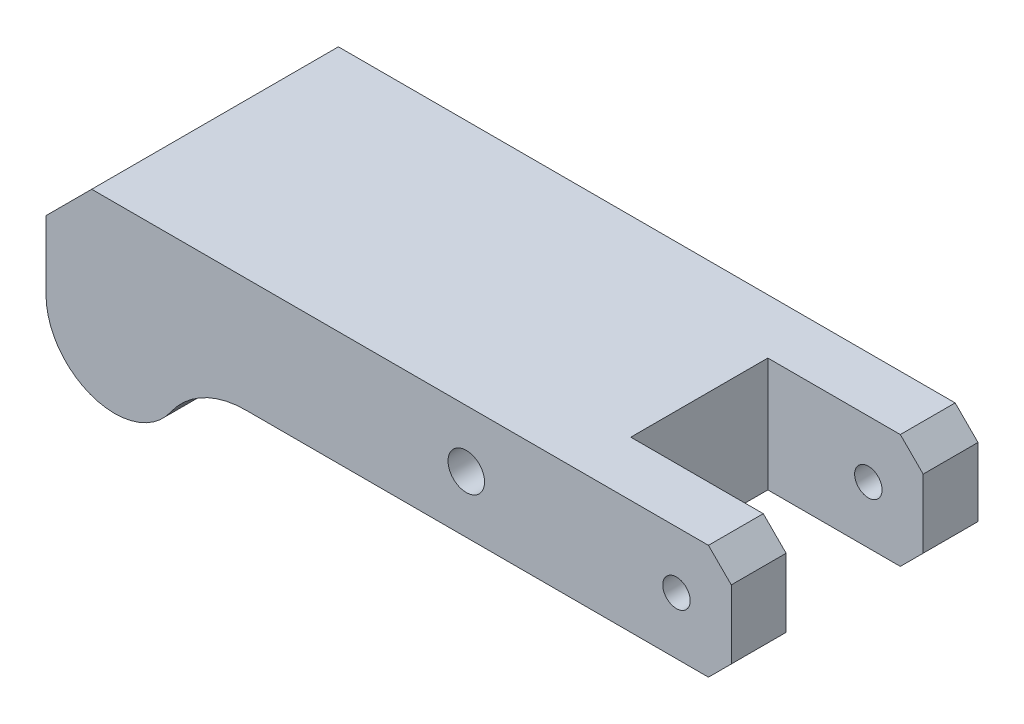
ISO-10303-21;
HEADER;
FILE_DESCRIPTION(('STEP AP214'),'2;1');
FILE_NAME('part.step','',(''),(''),'','','');
FILE_SCHEMA(('AUTOMOTIVE_DESIGN { 1 0 10303 214 1 1 1 1 }'));
ENDSEC;
DATA;
#1=APPLICATION_CONTEXT('core data for automotive mechanical design processes');
#2=APPLICATION_PROTOCOL_DEFINITION('international standard','automotive_design',2000,#1);
#3=PRODUCT_CONTEXT('',#1,'mechanical');
#4=PRODUCT('Part','Part','',(#3));
#5=PRODUCT_RELATED_PRODUCT_CATEGORY('part','',(#4));
#6=PRODUCT_DEFINITION_FORMATION('','',#4);
#7=PRODUCT_DEFINITION_CONTEXT('part definition',#1,'design');
#8=PRODUCT_DEFINITION('design','',#6,#7);
#9=PRODUCT_DEFINITION_SHAPE('','',#8);
#10=(LENGTH_UNIT() NAMED_UNIT(*) SI_UNIT(.MILLI.,.METRE.));
#11=(NAMED_UNIT(*) PLANE_ANGLE_UNIT() SI_UNIT($,.RADIAN.));
#12=(NAMED_UNIT(*) SI_UNIT($,.STERADIAN.) SOLID_ANGLE_UNIT());
#13=UNCERTAINTY_MEASURE_WITH_UNIT(LENGTH_MEASURE(1.E-05),#10,'distance_accuracy_value','');
#14=(GEOMETRIC_REPRESENTATION_CONTEXT(3) GLOBAL_UNCERTAINTY_ASSIGNED_CONTEXT((#13)) GLOBAL_UNIT_ASSIGNED_CONTEXT((#10,
#11,#12)) REPRESENTATION_CONTEXT('',''));
#15=CARTESIAN_POINT('',(0.,0.,0.));
#16=DIRECTION('',(0.,0.,1.));
#17=DIRECTION('',(1.,0.,0.));
#18=AXIS2_PLACEMENT_3D('',#15,#16,#17);
#19=CARTESIAN_POINT('',(43.7228132326901,0.,54.));
#20=DIRECTION('',(0.,1.,0.));
#21=DIRECTION('',(0.,0.,1.));
#22=AXIS2_PLACEMENT_3D('',#19,#20,#21);
#23=PLANE('',#22);
#24=DIRECTION('',(-1.,0.,0.));
#25=VECTOR('',#24,1.);
#26=CARTESIAN_POINT('',(43.7228132326901,0.,42.));
#27=LINE('',#26,#25);
#28=CARTESIAN_POINT('',(145.,0.,42.));
#29=VERTEX_POINT('',#28);
#30=CARTESIAN_POINT('',(116.,0.,42.));
#31=VERTEX_POINT('',#30);
#32=EDGE_CURVE('E186',#29,#31,#27,.T.);
#33=ORIENTED_EDGE('',*,*,#32,.F.);
#34=DIRECTION('',(0.,0.,1.));
#35=VECTOR('',#34,1.);
#36=CARTESIAN_POINT('',(145.,0.,54.));
#37=LINE('',#36,#35);
#38=CARTESIAN_POINT('',(145.,0.,54.));
#39=VERTEX_POINT('',#38);
#40=EDGE_CURVE('E255',#29,#39,#37,.T.);
#41=ORIENTED_EDGE('',*,*,#40,.T.);
#42=DIRECTION('',(1.,0.,0.));
#43=VECTOR('',#42,1.);
#44=CARTESIAN_POINT('',(43.7228132326901,0.,54.));
#45=LINE('',#44,#43);
#46=CARTESIAN_POINT('',(43.7228132326901,0.,54.));
#47=VERTEX_POINT('',#46);
#48=EDGE_CURVE('E211',#47,#39,#45,.T.);
#49=ORIENTED_EDGE('',*,*,#48,.F.);
#50=DIRECTION('',(0.,0.,-1.));
#51=VECTOR('',#50,1.);
#52=CARTESIAN_POINT('',(43.7228132326901,0.,54.));
#53=LINE('',#52,#51);
#54=CARTESIAN_POINT('',(43.7228132326901,0.,0.));
#55=VERTEX_POINT('',#54);
#56=EDGE_CURVE('E237',#47,#55,#53,.T.);
#57=ORIENTED_EDGE('',*,*,#56,.T.);
#58=DIRECTION('',(1.,0.,0.));
#59=VECTOR('',#58,1.);
#60=CARTESIAN_POINT('',(43.7228132326901,0.,0.));
#61=LINE('',#60,#59);
#62=CARTESIAN_POINT('',(145.,0.,0.));
#63=VERTEX_POINT('',#62);
#64=EDGE_CURVE('E226',#55,#63,#61,.T.);
#65=ORIENTED_EDGE('',*,*,#64,.T.);
#66=CARTESIAN_POINT('',(145.,0.,12.));
#67=VERTEX_POINT('',#66);
#68=EDGE_CURVE('E256',#63,#67,#37,.T.);
#69=ORIENTED_EDGE('',*,*,#68,.T.);
#70=DIRECTION('',(-1.,0.,0.));
#71=VECTOR('',#70,1.);
#72=CARTESIAN_POINT('',(43.7228132326901,0.,12.));
#73=LINE('',#72,#71);
#74=CARTESIAN_POINT('',(116.,0.,12.));
#75=VERTEX_POINT('',#74);
#76=EDGE_CURVE('E178',#67,#75,#73,.T.);
#77=ORIENTED_EDGE('',*,*,#76,.T.);
#78=DIRECTION('',(0.,0.,-1.));
#79=VECTOR('',#78,1.);
#80=CARTESIAN_POINT('',(116.,0.,54.));
#81=LINE('',#80,#79);
#82=EDGE_CURVE('E156',#31,#75,#81,.T.);
#83=ORIENTED_EDGE('',*,*,#82,.F.);
#84=EDGE_LOOP('',(#33,#41,#49,#57,#65,#69,#77,#83));
#85=FACE_BOUND('',#84,.T.);
#86=ADVANCED_FACE('F39',(#85),#23,.F.);
#87=CARTESIAN_POINT('',(150.,0.,54.));
#88=DIRECTION('',(-1.,0.,0.));
#89=DIRECTION('',(0.,0.,1.));
#90=AXIS2_PLACEMENT_3D('',#87,#88,#89);
#91=PLANE('',#90);
#92=DIRECTION('',(0.,1.,0.));
#93=VECTOR('',#92,1.);
#94=CARTESIAN_POINT('',(150.,-15.,42.));
#95=LINE('',#94,#93);
#96=CARTESIAN_POINT('',(150.,5.00000000000002,42.));
#97=VERTEX_POINT('',#96);
#98=CARTESIAN_POINT('',(150.,20.,42.));
#99=VERTEX_POINT('',#98);
#100=EDGE_CURVE('E171',#97,#99,#95,.T.);
#101=ORIENTED_EDGE('',*,*,#100,.T.);
#102=DIRECTION('',(0.,0.,1.));
#103=VECTOR('',#102,1.);
#104=CARTESIAN_POINT('',(150.,20.,54.));
#105=LINE('',#104,#103);
#106=CARTESIAN_POINT('',(150.,20.,54.));
#107=VERTEX_POINT('',#106);
#108=EDGE_CURVE('E243',#99,#107,#105,.T.);
#109=ORIENTED_EDGE('',*,*,#108,.T.);
#110=DIRECTION('',(0.,1.,0.));
#111=VECTOR('',#110,1.);
#112=CARTESIAN_POINT('',(150.,0.,54.));
#113=LINE('',#112,#111);
#114=CARTESIAN_POINT('',(150.,5.00000000000002,54.));
#115=VERTEX_POINT('',#114);
#116=EDGE_CURVE('E214',#115,#107,#113,.T.);
#117=ORIENTED_EDGE('',*,*,#116,.F.);
#118=DIRECTION('',(0.,0.,-1.));
#119=VECTOR('',#118,1.);
#120=CARTESIAN_POINT('',(150.,5.00000000000002,54.));
#121=LINE('',#120,#119);
#122=EDGE_CURVE('E248',#115,#97,#121,.T.);
#123=ORIENTED_EDGE('',*,*,#122,.T.);
#124=EDGE_LOOP('',(#101,#109,#117,#123));
#125=FACE_BOUND('',#124,.T.);
#126=ADVANCED_FACE('F320',(#125),#91,.F.);
#127=CARTESIAN_POINT('',(0.,25.,54.));
#128=DIRECTION('',(0.,-1.,0.));
#129=DIRECTION('',(0.,0.,-1.));
#130=AXIS2_PLACEMENT_3D('',#127,#128,#129);
#131=PLANE('',#130);
#132=DIRECTION('',(-1.,0.,0.));
#133=VECTOR('',#132,1.);
#134=CARTESIAN_POINT('',(0.,25.,42.));
#135=LINE('',#134,#133);
#136=CARTESIAN_POINT('',(145.,25.,42.));
#137=VERTEX_POINT('',#136);
#138=CARTESIAN_POINT('',(116.,25.,42.));
#139=VERTEX_POINT('',#138);
#140=EDGE_CURVE('E167',#137,#139,#135,.T.);
#141=ORIENTED_EDGE('',*,*,#140,.T.);
#142=DIRECTION('',(0.,0.,-1.));
#143=VECTOR('',#142,1.);
#144=CARTESIAN_POINT('',(116.,25.,0.));
#145=LINE('',#144,#143);
#146=CARTESIAN_POINT('',(116.,25.,12.));
#147=VERTEX_POINT('',#146);
#148=EDGE_CURVE('E153',#139,#147,#145,.T.);
#149=ORIENTED_EDGE('',*,*,#148,.T.);
#150=DIRECTION('',(-1.,0.,0.));
#151=VECTOR('',#150,1.);
#152=CARTESIAN_POINT('',(0.,25.,12.));
#153=LINE('',#152,#151);
#154=CARTESIAN_POINT('',(145.,25.,12.));
#155=VERTEX_POINT('',#154);
#156=EDGE_CURVE('E161',#155,#147,#153,.T.);
#157=ORIENTED_EDGE('',*,*,#156,.F.);
#158=DIRECTION('',(0.,0.,-1.));
#159=VECTOR('',#158,1.);
#160=CARTESIAN_POINT('',(145.,25.,54.));
#161=LINE('',#160,#159);
#162=CARTESIAN_POINT('',(145.,25.,0.));
#163=VERTEX_POINT('',#162);
#164=EDGE_CURVE('E263',#155,#163,#161,.T.);
#165=ORIENTED_EDGE('',*,*,#164,.T.);
#166=DIRECTION('',(-1.,0.,0.));
#167=VECTOR('',#166,1.);
#168=CARTESIAN_POINT('',(0.,25.,0.));
#169=LINE('',#168,#167);
#170=CARTESIAN_POINT('',(10.,25.,0.));
#171=VERTEX_POINT('',#170);
#172=EDGE_CURVE('E232',#163,#171,#169,.T.);
#173=ORIENTED_EDGE('',*,*,#172,.T.);
#174=DIRECTION('',(0.,0.,1.));
#175=VECTOR('',#174,1.);
#176=CARTESIAN_POINT('',(10.,25.,54.));
#177=LINE('',#176,#175);
#178=CARTESIAN_POINT('',(10.,25.,54.));
#179=VERTEX_POINT('',#178);
#180=EDGE_CURVE('E62',#171,#179,#177,.T.);
#181=ORIENTED_EDGE('',*,*,#180,.T.);
#182=DIRECTION('',(-1.,0.,0.));
#183=VECTOR('',#182,1.);
#184=CARTESIAN_POINT('',(0.,25.,54.));
#185=LINE('',#184,#183);
#186=CARTESIAN_POINT('',(145.,25.,54.));
#187=VERTEX_POINT('',#186);
#188=EDGE_CURVE('E217',#187,#179,#185,.T.);
#189=ORIENTED_EDGE('',*,*,#188,.F.);
#190=EDGE_CURVE('E264',#187,#137,#161,.T.);
#191=ORIENTED_EDGE('',*,*,#190,.T.);
#192=EDGE_LOOP('',(#141,#149,#157,#165,#173,#181,#189,#191));
#193=FACE_BOUND('',#192,.T.);
#194=ADVANCED_FACE('F165',(#193),#131,.F.);
#195=CARTESIAN_POINT('',(138.,12.5,54.));
#196=DIRECTION('',(0.,0.,-1.));
#197=DIRECTION('',(-1.,0.,0.));
#198=AXIS2_PLACEMENT_3D('',#195,#196,#197);
#199=CYLINDRICAL_SURFACE('',#198,2.99999999999999);
#200=CARTESIAN_POINT('',(138.,12.5,54.));
#201=DIRECTION('',(0.,0.,1.));
#202=DIRECTION('',(1.,0.,0.));
#203=AXIS2_PLACEMENT_3D('',#200,#201,#202);
#204=CIRCLE('',#203,2.99999999999999);
#205=CARTESIAN_POINT('',(141.,12.5,54.));
#206=VERTEX_POINT('',#205);
#207=EDGE_CURVE('E199',#206,#206,#204,.T.);
#208=ORIENTED_EDGE('',*,*,#207,.T.);
#209=EDGE_LOOP('',(#208));
#210=FACE_BOUND('',#209,.T.);
#211=CARTESIAN_POINT('',(138.,12.5,42.));
#212=DIRECTION('',(0.,0.,-1.));
#213=DIRECTION('',(-1.,0.,0.));
#214=AXIS2_PLACEMENT_3D('',#211,#212,#213);
#215=CIRCLE('',#214,2.99999999999999);
#216=CARTESIAN_POINT('',(135.,12.5,42.));
#217=VERTEX_POINT('',#216);
#218=EDGE_CURVE('E188',#217,#217,#215,.T.);
#219=ORIENTED_EDGE('',*,*,#218,.T.);
#220=EDGE_LOOP('',(#219));
#221=FACE_BOUND('',#220,.T.);
#222=ADVANCED_FACE('F365',(#210,#221),#199,.F.);
#223=CARTESIAN_POINT('',(150.,5.00000000000002,54.));
#224=DIRECTION('',(-0.707106781186546,0.707106781186548,0.));
#225=DIRECTION('',(0.,0.,-1.));
#226=AXIS2_PLACEMENT_3D('',#223,#224,#225);
#227=PLANE('',#226);
#228=ORIENTED_EDGE('',*,*,#40,.F.);
#229=DIRECTION('',(-0.707106781186549,-0.707106781186547,0.));
#230=VECTOR('',#229,1.);
#231=CARTESIAN_POINT('',(150.,5.00000000000002,42.));
#232=LINE('',#231,#230);
#233=EDGE_CURVE('E183',#29,#97,#232,.F.);
#234=ORIENTED_EDGE('',*,*,#233,.T.);
#235=ORIENTED_EDGE('',*,*,#122,.F.);
#236=DIRECTION('',(-0.707106781186549,-0.707106781186547,0.));
#237=VECTOR('',#236,1.);
#238=CARTESIAN_POINT('',(79.9999999999998,-65.,54.));
#239=LINE('',#238,#237);
#240=EDGE_CURVE('E261',#39,#115,#239,.F.);
#241=ORIENTED_EDGE('',*,*,#240,.F.);
#242=EDGE_LOOP('',(#228,#234,#235,#241));
#243=FACE_BOUND('',#242,.T.);
#244=ADVANCED_FACE('F318',(#243),#227,.F.);
#245=CARTESIAN_POINT('',(145.,25.,54.));
#246=DIRECTION('',(-0.707106781186551,-0.707106781186544,0.));
#247=DIRECTION('',(0.,0.,-1.));
#248=AXIS2_PLACEMENT_3D('',#245,#246,#247);
#249=PLANE('',#248);
#250=ORIENTED_EDGE('',*,*,#108,.F.);
#251=DIRECTION('',(0.707106781186544,-0.707106781186551,0.));
#252=VECTOR('',#251,1.);
#253=CARTESIAN_POINT('',(145.,25.,42.));
#254=LINE('',#253,#252);
#255=EDGE_CURVE('E11',#99,#137,#254,.F.);
#256=ORIENTED_EDGE('',*,*,#255,.T.);
#257=ORIENTED_EDGE('',*,*,#190,.F.);
#258=DIRECTION('',(0.707106781186544,-0.707106781186551,0.));
#259=VECTOR('',#258,1.);
#260=CARTESIAN_POINT('',(92.5000000000007,77.4999999999999,54.));
#261=LINE('',#260,#259);
#262=EDGE_CURVE('E259',#107,#187,#261,.F.);
#263=ORIENTED_EDGE('',*,*,#262,.F.);
#264=EDGE_LOOP('',(#250,#256,#257,#263));
#265=FACE_BOUND('',#264,.T.);
#266=ADVANCED_FACE('F325',(#265),#249,.F.);
#267=CARTESIAN_POINT('',(15.,0.,54.));
#268=DIRECTION('',(0.,0.,1.));
#269=DIRECTION('',(1.,0.,0.));
#270=AXIS2_PLACEMENT_3D('',#267,#268,#269);
#271=PLANE('',#270);
#272=ORIENTED_EDGE('',*,*,#207,.F.);
#273=EDGE_LOOP('',(#272));
#274=FACE_BOUND('',#273,.T.);
#275=ORIENTED_EDGE('',*,*,#188,.T.);
#276=DIRECTION('',(0.707106781186548,0.707106781186547,0.));
#277=VECTOR('',#276,1.);
#278=CARTESIAN_POINT('',(0.,15.,54.));
#279=LINE('',#278,#277);
#280=CARTESIAN_POINT('',(0.,15.,54.));
#281=VERTEX_POINT('',#280);
#282=EDGE_CURVE('E272',#179,#281,#279,.F.);
#283=ORIENTED_EDGE('',*,*,#282,.T.);
#284=DIRECTION('',(0.,-1.,0.));
#285=VECTOR('',#284,1.);
#286=CARTESIAN_POINT('',(0.,0.,54.));
#287=LINE('',#286,#285);
#288=CARTESIAN_POINT('',(0.,0.,54.));
#289=VERTEX_POINT('',#288);
#290=EDGE_CURVE('E219',#281,#289,#287,.T.);
#291=ORIENTED_EDGE('',*,*,#290,.T.);
#292=CARTESIAN_POINT('',(15.,0.,54.));
#293=DIRECTION('',(0.,0.,1.));
#294=DIRECTION('',(1.,0.,0.));
#295=AXIS2_PLACEMENT_3D('',#292,#293,#294);
#296=CIRCLE('',#295,15.);
#297=CARTESIAN_POINT('',(27.3097770997244,-8.57142857142857,54.));
#298=VERTEX_POINT('',#297);
#299=EDGE_CURVE('E205',#289,#298,#296,.T.);
#300=ORIENTED_EDGE('',*,*,#299,.T.);
#301=CARTESIAN_POINT('',(43.7228132326901,-20.,54.));
#302=DIRECTION('',(0.,0.,-1.));
#303=DIRECTION('',(1.,0.,0.));
#304=AXIS2_PLACEMENT_3D('',#301,#302,#303);
#305=CIRCLE('',#304,20.);
#306=EDGE_CURVE('E208',#298,#47,#305,.T.);
#307=ORIENTED_EDGE('',*,*,#306,.T.);
#308=ORIENTED_EDGE('',*,*,#48,.T.);
#309=ORIENTED_EDGE('',*,*,#240,.T.);
#310=ORIENTED_EDGE('',*,*,#116,.T.);
#311=ORIENTED_EDGE('',*,*,#262,.T.);
#312=EDGE_LOOP('',(#275,#283,#291,#300,#307,#308,#309,#310,#311));
#313=FACE_BOUND('',#312,.T.);
#314=CARTESIAN_POINT('',(92.,12.5,54.));
#315=DIRECTION('',(0.,0.,1.));
#316=DIRECTION('',(1.,0.,0.));
#317=AXIS2_PLACEMENT_3D('',#314,#315,#316);
#318=CIRCLE('',#317,4.00000000000001);
#319=CARTESIAN_POINT('',(96.,12.5,54.));
#320=VERTEX_POINT('',#319);
#321=EDGE_CURVE('E193',#320,#320,#318,.T.);
#322=ORIENTED_EDGE('',*,*,#321,.F.);
#323=EDGE_LOOP('',(#322));
#324=FACE_BOUND('',#323,.T.);
#325=ADVANCED_FACE('F276',(#274,#313,#324),#271,.T.);
#326=CARTESIAN_POINT('',(15.,0.,0.));
#327=DIRECTION('',(0.,0.,1.));
#328=DIRECTION('',(1.,0.,0.));
#329=AXIS2_PLACEMENT_3D('',#326,#327,#328);
#330=PLANE('',#329);
#331=DIRECTION('',(0.,-1.,0.));
#332=VECTOR('',#331,1.);
#333=CARTESIAN_POINT('',(0.,0.,0.));
#334=LINE('',#333,#332);
#335=CARTESIAN_POINT('',(0.,15.,0.));
#336=VERTEX_POINT('',#335);
#337=CARTESIAN_POINT('',(0.,0.,0.));
#338=VERTEX_POINT('',#337);
#339=EDGE_CURVE('E209',#336,#338,#334,.T.);
#340=ORIENTED_EDGE('',*,*,#339,.F.);
#341=DIRECTION('',(-0.707106781186548,-0.707106781186547,0.));
#342=VECTOR('',#341,1.);
#343=CARTESIAN_POINT('',(0.,15.,0.));
#344=LINE('',#343,#342);
#345=EDGE_CURVE('E269',#336,#171,#344,.F.);
#346=ORIENTED_EDGE('',*,*,#345,.T.);
#347=ORIENTED_EDGE('',*,*,#172,.F.);
#348=DIRECTION('',(-0.707106781186544,0.707106781186551,0.));
#349=VECTOR('',#348,1.);
#350=CARTESIAN_POINT('',(145.,25.,0.));
#351=LINE('',#350,#349);
#352=CARTESIAN_POINT('',(150.,20.,0.));
#353=VERTEX_POINT('',#352);
#354=EDGE_CURVE('E251',#163,#353,#351,.F.);
#355=ORIENTED_EDGE('',*,*,#354,.T.);
#356=DIRECTION('',(0.,1.,0.));
#357=VECTOR('',#356,1.);
#358=CARTESIAN_POINT('',(150.,0.,0.));
#359=LINE('',#358,#357);
#360=CARTESIAN_POINT('',(150.,5.00000000000002,0.));
#361=VERTEX_POINT('',#360);
#362=EDGE_CURVE('E229',#361,#353,#359,.T.);
#363=ORIENTED_EDGE('',*,*,#362,.F.);
#364=DIRECTION('',(0.707106781186549,0.707106781186547,0.));
#365=VECTOR('',#364,1.);
#366=CARTESIAN_POINT('',(150.,5.00000000000002,0.));
#367=LINE('',#366,#365);
#368=EDGE_CURVE('E253',#361,#63,#367,.F.);
#369=ORIENTED_EDGE('',*,*,#368,.T.);
#370=ORIENTED_EDGE('',*,*,#64,.F.);
#371=CARTESIAN_POINT('',(43.7228132326901,-20.,0.));
#372=DIRECTION('',(0.,0.,-1.));
#373=DIRECTION('',(1.,0.,0.));
#374=AXIS2_PLACEMENT_3D('',#371,#372,#373);
#375=CIRCLE('',#374,20.);
#376=CARTESIAN_POINT('',(27.3097770997244,-8.57142857142857,0.));
#377=VERTEX_POINT('',#376);
#378=EDGE_CURVE('E224',#377,#55,#375,.T.);
#379=ORIENTED_EDGE('',*,*,#378,.F.);
#380=CARTESIAN_POINT('',(15.,0.,0.));
#381=DIRECTION('',(0.,0.,1.));
#382=DIRECTION('',(1.,0.,0.));
#383=AXIS2_PLACEMENT_3D('',#380,#381,#382);
#384=CIRCLE('',#383,15.);
#385=EDGE_CURVE('E202',#338,#377,#384,.T.);
#386=ORIENTED_EDGE('',*,*,#385,.F.);
#387=EDGE_LOOP('',(#340,#346,#347,#355,#363,#369,#370,#379,#386));
#388=FACE_BOUND('',#387,.T.);
#389=CARTESIAN_POINT('',(138.,12.5,0.));
#390=DIRECTION('',(0.,0.,1.));
#391=DIRECTION('',(1.,0.,0.));
#392=AXIS2_PLACEMENT_3D('',#389,#390,#391);
#393=CIRCLE('',#392,2.99999999999999);
#394=CARTESIAN_POINT('',(141.,12.5,0.));
#395=VERTEX_POINT('',#394);
#396=EDGE_CURVE('E196',#395,#395,#393,.T.);
#397=ORIENTED_EDGE('',*,*,#396,.T.);
#398=EDGE_LOOP('',(#397));
#399=FACE_BOUND('',#398,.T.);
#400=CARTESIAN_POINT('',(92.,12.5,0.));
#401=DIRECTION('',(0.,0.,1.));
#402=DIRECTION('',(1.,0.,0.));
#403=AXIS2_PLACEMENT_3D('',#400,#401,#402);
#404=CIRCLE('',#403,4.00000000000001);
#405=CARTESIAN_POINT('',(96.,12.5,0.));
#406=VERTEX_POINT('',#405);
#407=EDGE_CURVE('E192',#406,#406,#404,.T.);
#408=ORIENTED_EDGE('',*,*,#407,.T.);
#409=EDGE_LOOP('',(#408));
#410=FACE_BOUND('',#409,.T.);
#411=ADVANCED_FACE('F287',(#388,#399,#410),#330,.F.);
#412=CARTESIAN_POINT('',(15.,0.,54.));
#413=DIRECTION('',(0.,0.,-1.));
#414=DIRECTION('',(-1.,0.,0.));
#415=AXIS2_PLACEMENT_3D('',#412,#413,#414);
#416=CYLINDRICAL_SURFACE('',#415,15.);
#417=ORIENTED_EDGE('',*,*,#385,.T.);
#418=DIRECTION('',(0.,0.,-1.));
#419=VECTOR('',#418,1.);
#420=CARTESIAN_POINT('',(27.3097770997244,-8.57142857142857,54.));
#421=LINE('',#420,#419);
#422=EDGE_CURVE('E240',#298,#377,#421,.T.);
#423=ORIENTED_EDGE('',*,*,#422,.F.);
#424=ORIENTED_EDGE('',*,*,#299,.F.);
#425=DIRECTION('',(0.,0.,-1.));
#426=VECTOR('',#425,1.);
#427=CARTESIAN_POINT('',(0.,0.,54.));
#428=LINE('',#427,#426);
#429=EDGE_CURVE('E221',#289,#338,#428,.T.);
#430=ORIENTED_EDGE('',*,*,#429,.T.);
#431=EDGE_LOOP('',(#417,#423,#424,#430));
#432=FACE_BOUND('',#431,.T.);
#433=ADVANCED_FACE('F312',(#432),#416,.T.);
#434=CARTESIAN_POINT('',(43.7228132326901,-20.,54.));
#435=DIRECTION('',(0.,0.,-1.));
#436=DIRECTION('',(-1.,0.,0.));
#437=AXIS2_PLACEMENT_3D('',#434,#435,#436);
#438=CYLINDRICAL_SURFACE('',#437,20.);
#439=ORIENTED_EDGE('',*,*,#378,.T.);
#440=ORIENTED_EDGE('',*,*,#56,.F.);
#441=ORIENTED_EDGE('',*,*,#306,.F.);
#442=ORIENTED_EDGE('',*,*,#422,.T.);
#443=EDGE_LOOP('',(#439,#440,#441,#442));
#444=FACE_BOUND('',#443,.T.);
#445=ADVANCED_FACE('F309',(#444),#438,.F.);
#446=CARTESIAN_POINT('',(150.,20.,12.));
#447=VERTEX_POINT('',#446);
#448=EDGE_CURVE('E244',#353,#447,#105,.T.);
#449=ORIENTED_EDGE('',*,*,#448,.T.);
#450=DIRECTION('',(0.,1.,0.));
#451=VECTOR('',#450,1.);
#452=CARTESIAN_POINT('',(150.,-15.,12.));
#453=LINE('',#452,#451);
#454=CARTESIAN_POINT('',(150.,5.00000000000002,12.));
#455=VERTEX_POINT('',#454);
#456=EDGE_CURVE('E54',#455,#447,#453,.T.);
#457=ORIENTED_EDGE('',*,*,#456,.F.);
#458=EDGE_CURVE('E247',#455,#361,#121,.T.);
#459=ORIENTED_EDGE('',*,*,#458,.T.);
#460=ORIENTED_EDGE('',*,*,#362,.T.);
#461=EDGE_LOOP('',(#449,#457,#459,#460));
#462=FACE_BOUND('',#461,.T.);
#463=ADVANCED_FACE('F296',(#462),#91,.F.);
#464=CARTESIAN_POINT('',(0.,0.,54.));
#465=DIRECTION('',(1.,0.,0.));
#466=DIRECTION('',(0.,0.,-1.));
#467=AXIS2_PLACEMENT_3D('',#464,#465,#466);
#468=PLANE('',#467);
#469=ORIENTED_EDGE('',*,*,#290,.F.);
#470=DIRECTION('',(0.,0.,-1.));
#471=VECTOR('',#470,1.);
#472=CARTESIAN_POINT('',(0.,15.,54.));
#473=LINE('',#472,#471);
#474=EDGE_CURVE('E266',#281,#336,#473,.T.);
#475=ORIENTED_EDGE('',*,*,#474,.T.);
#476=ORIENTED_EDGE('',*,*,#339,.T.);
#477=ORIENTED_EDGE('',*,*,#429,.F.);
#478=EDGE_LOOP('',(#469,#475,#476,#477));
#479=FACE_BOUND('',#478,.T.);
#480=ADVANCED_FACE('F282',(#479),#468,.F.);
#481=CARTESIAN_POINT('',(138.,12.5,12.));
#482=DIRECTION('',(0.,0.,-1.));
#483=DIRECTION('',(-1.,0.,0.));
#484=AXIS2_PLACEMENT_3D('',#481,#482,#483);
#485=CIRCLE('',#484,2.99999999999999);
#486=CARTESIAN_POINT('',(135.,12.5,12.));
#487=VERTEX_POINT('',#486);
#488=EDGE_CURVE('E180',#487,#487,#485,.T.);
#489=ORIENTED_EDGE('',*,*,#488,.F.);
#490=EDGE_LOOP('',(#489));
#491=FACE_BOUND('',#490,.T.);
#492=ORIENTED_EDGE('',*,*,#396,.F.);
#493=EDGE_LOOP('',(#492));
#494=FACE_BOUND('',#493,.T.);
#495=ADVANCED_FACE('F372',(#491,#494),#199,.F.);
#496=CARTESIAN_POINT('',(92.,12.5,54.));
#497=DIRECTION('',(0.,0.,-1.));
#498=DIRECTION('',(-1.,0.,0.));
#499=AXIS2_PLACEMENT_3D('',#496,#497,#498);
#500=CYLINDRICAL_SURFACE('',#499,4.00000000000001);
#501=ORIENTED_EDGE('',*,*,#321,.T.);
#502=EDGE_LOOP('',(#501));
#503=FACE_BOUND('',#502,.T.);
#504=ORIENTED_EDGE('',*,*,#407,.F.);
#505=EDGE_LOOP('',(#504));
#506=FACE_BOUND('',#505,.T.);
#507=ADVANCED_FACE('F353',(#503,#506),#500,.F.);
#508=DIRECTION('',(-0.707106781186549,-0.707106781186547,0.));
#509=VECTOR('',#508,1.);
#510=CARTESIAN_POINT('',(150.,5.00000000000002,12.));
#511=LINE('',#510,#509);
#512=EDGE_CURVE('E174',#67,#455,#511,.F.);
#513=ORIENTED_EDGE('',*,*,#512,.F.);
#514=ORIENTED_EDGE('',*,*,#68,.F.);
#515=ORIENTED_EDGE('',*,*,#368,.F.);
#516=ORIENTED_EDGE('',*,*,#458,.F.);
#517=EDGE_LOOP('',(#513,#514,#515,#516));
#518=FACE_BOUND('',#517,.T.);
#519=ADVANCED_FACE('F302',(#518),#227,.F.);
#520=DIRECTION('',(0.707106781186544,-0.707106781186551,0.));
#521=VECTOR('',#520,1.);
#522=CARTESIAN_POINT('',(145.,25.,12.));
#523=LINE('',#522,#521);
#524=EDGE_CURVE('E47',#447,#155,#523,.F.);
#525=ORIENTED_EDGE('',*,*,#524,.F.);
#526=ORIENTED_EDGE('',*,*,#448,.F.);
#527=ORIENTED_EDGE('',*,*,#354,.F.);
#528=ORIENTED_EDGE('',*,*,#164,.F.);
#529=EDGE_LOOP('',(#525,#526,#527,#528));
#530=FACE_BOUND('',#529,.T.);
#531=ADVANCED_FACE('F293',(#530),#249,.F.);
#532=CARTESIAN_POINT('',(0.,15.,54.));
#533=DIRECTION('',(0.707106781186547,-0.707106781186548,0.));
#534=DIRECTION('',(0.,0.,-1.));
#535=AXIS2_PLACEMENT_3D('',#532,#533,#534);
#536=PLANE('',#535);
#537=ORIENTED_EDGE('',*,*,#282,.F.);
#538=ORIENTED_EDGE('',*,*,#180,.F.);
#539=ORIENTED_EDGE('',*,*,#345,.F.);
#540=ORIENTED_EDGE('',*,*,#474,.F.);
#541=EDGE_LOOP('',(#537,#538,#539,#540));
#542=FACE_BOUND('',#541,.T.);
#543=ADVANCED_FACE('F41',(#542),#536,.F.);
#544=CARTESIAN_POINT('',(116.,-15.,0.));
#545=DIRECTION('',(1.,0.,0.));
#546=DIRECTION('',(0.,0.,-1.));
#547=AXIS2_PLACEMENT_3D('',#544,#545,#546);
#548=PLANE('',#547);
#549=ORIENTED_EDGE('',*,*,#82,.T.);
#550=DIRECTION('',(0.,1.,0.));
#551=VECTOR('',#550,1.);
#552=CARTESIAN_POINT('',(116.,-15.,12.));
#553=LINE('',#552,#551);
#554=EDGE_CURVE('E148',#75,#147,#553,.T.);
#555=ORIENTED_EDGE('',*,*,#554,.T.);
#556=ORIENTED_EDGE('',*,*,#148,.F.);
#557=DIRECTION('',(0.,1.,0.));
#558=VECTOR('',#557,1.);
#559=CARTESIAN_POINT('',(116.,-15.,42.));
#560=LINE('',#559,#558);
#561=EDGE_CURVE('E158',#31,#139,#560,.T.);
#562=ORIENTED_EDGE('',*,*,#561,.F.);
#563=EDGE_LOOP('',(#549,#555,#556,#562));
#564=FACE_BOUND('',#563,.T.);
#565=ADVANCED_FACE('F150',(#564),#548,.T.);
#566=CARTESIAN_POINT('',(0.,-15.,42.));
#567=DIRECTION('',(0.,0.,-1.));
#568=DIRECTION('',(-1.,0.,0.));
#569=AXIS2_PLACEMENT_3D('',#566,#567,#568);
#570=PLANE('',#569);
#571=ORIENTED_EDGE('',*,*,#218,.F.);
#572=EDGE_LOOP('',(#571));
#573=FACE_BOUND('',#572,.T.);
#574=ORIENTED_EDGE('',*,*,#32,.T.);
#575=ORIENTED_EDGE('',*,*,#561,.T.);
#576=ORIENTED_EDGE('',*,*,#140,.F.);
#577=ORIENTED_EDGE('',*,*,#255,.F.);
#578=ORIENTED_EDGE('',*,*,#100,.F.);
#579=ORIENTED_EDGE('',*,*,#233,.F.);
#580=EDGE_LOOP('',(#574,#575,#576,#577,#578,#579));
#581=FACE_BOUND('',#580,.T.);
#582=ADVANCED_FACE('F327',(#573,#581),#570,.T.);
#583=CARTESIAN_POINT('',(0.,-15.,12.));
#584=DIRECTION('',(0.,0.,-1.));
#585=DIRECTION('',(-1.,0.,0.));
#586=AXIS2_PLACEMENT_3D('',#583,#584,#585);
#587=PLANE('',#586);
#588=ORIENTED_EDGE('',*,*,#488,.T.);
#589=EDGE_LOOP('',(#588));
#590=FACE_BOUND('',#589,.T.);
#591=ORIENTED_EDGE('',*,*,#512,.T.);
#592=ORIENTED_EDGE('',*,*,#456,.T.);
#593=ORIENTED_EDGE('',*,*,#524,.T.);
#594=ORIENTED_EDGE('',*,*,#156,.T.);
#595=ORIENTED_EDGE('',*,*,#554,.F.);
#596=ORIENTED_EDGE('',*,*,#76,.F.);
#597=EDGE_LOOP('',(#591,#592,#593,#594,#595,#596));
#598=FACE_BOUND('',#597,.T.);
#599=ADVANCED_FACE('F162',(#590,#598),#587,.F.);
#600=CLOSED_SHELL('',(#86,#126,#194,#222,#244,#266,#325,#411,#433,#445,#463,#480,#495,#507,#519,
#531,#543,#565,#582,#599));
#601=MANIFOLD_SOLID_BREP('B2',#600);
#602=ADVANCED_BREP_SHAPE_REPRESENTATION('',(#18,#601),#14);
#603=SHAPE_DEFINITION_REPRESENTATION(#9,#602);
ENDSEC;
END-ISO-10303-21;
